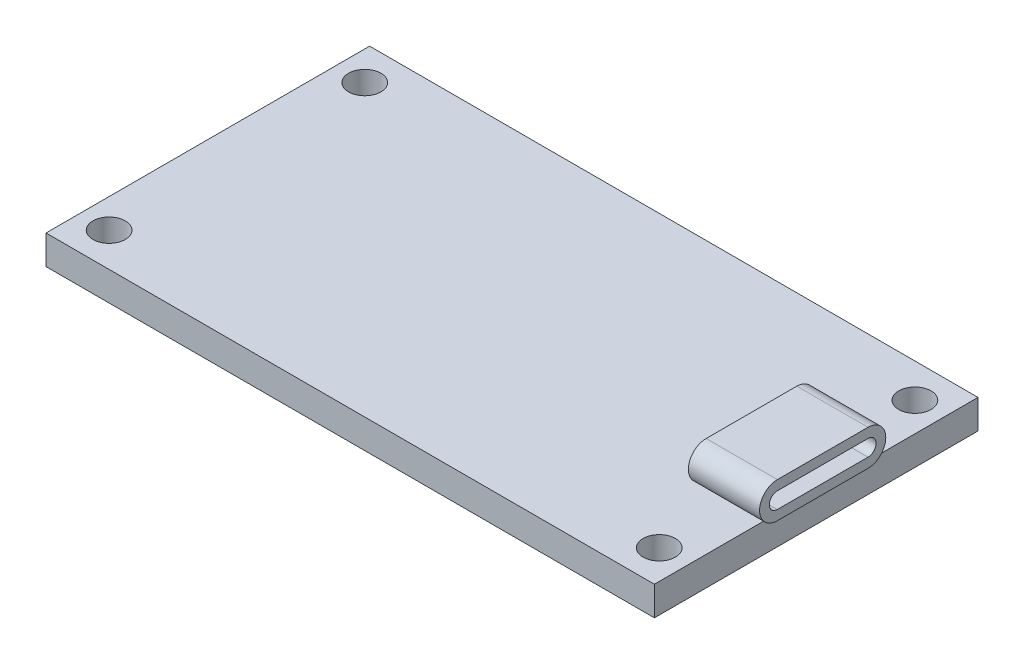
ISO-10303-21;
HEADER;
FILE_DESCRIPTION(('STEP AP214'),'2;1');
FILE_NAME('part.step','',(''),(''),'','','');
FILE_SCHEMA(('AUTOMOTIVE_DESIGN { 1 0 10303 214 1 1 1 1 }'));
ENDSEC;
DATA;
#1=APPLICATION_CONTEXT('core data for automotive mechanical design processes');
#2=APPLICATION_PROTOCOL_DEFINITION('international standard','automotive_design',2000,#1);
#3=PRODUCT_CONTEXT('',#1,'mechanical');
#4=PRODUCT('Part','Part','',(#3));
#5=PRODUCT_RELATED_PRODUCT_CATEGORY('part','',(#4));
#6=PRODUCT_DEFINITION_FORMATION('','',#4);
#7=PRODUCT_DEFINITION_CONTEXT('part definition',#1,'design');
#8=PRODUCT_DEFINITION('design','',#6,#7);
#9=PRODUCT_DEFINITION_SHAPE('','',#8);
#10=(LENGTH_UNIT() NAMED_UNIT(*) SI_UNIT(.MILLI.,.METRE.));
#11=(NAMED_UNIT(*) PLANE_ANGLE_UNIT() SI_UNIT($,.RADIAN.));
#12=(NAMED_UNIT(*) SI_UNIT($,.STERADIAN.) SOLID_ANGLE_UNIT());
#13=UNCERTAINTY_MEASURE_WITH_UNIT(LENGTH_MEASURE(1.E-05),#10,'distance_accuracy_value','');
#14=(GEOMETRIC_REPRESENTATION_CONTEXT(3) GLOBAL_UNCERTAINTY_ASSIGNED_CONTEXT((#13)) GLOBAL_UNIT_ASSIGNED_CONTEXT((#10,
#11,#12)) REPRESENTATION_CONTEXT('',''));
#15=CARTESIAN_POINT('',(0.,0.,0.));
#16=DIRECTION('',(0.,0.,1.));
#17=DIRECTION('',(1.,0.,0.));
#18=AXIS2_PLACEMENT_3D('',#15,#16,#17);
#19=CARTESIAN_POINT('',(0.,2.286,0.));
#20=DIRECTION('',(0.,1.,0.));
#21=DIRECTION('',(0.,0.,1.));
#22=AXIS2_PLACEMENT_3D('',#19,#20,#21);
#23=PLANE('',#22);
#24=DIRECTION('',(1.,0.,0.));
#25=VECTOR('',#24,1.);
#26=CARTESIAN_POINT('',(18.796,2.286,3.556));
#27=LINE('',#26,#25);
#28=CARTESIAN_POINT('',(18.796,2.286,3.556));
#29=VERTEX_POINT('',#28);
#30=CARTESIAN_POINT('',(23.876,2.286,3.556));
#31=VERTEX_POINT('',#30);
#32=EDGE_CURVE('E199',#29,#31,#27,.T.);
#33=ORIENTED_EDGE('',*,*,#32,.F.);
#34=DIRECTION('',(0.,0.,-1.));
#35=VECTOR('',#34,1.);
#36=CARTESIAN_POINT('',(18.796,2.286,3.556));
#37=LINE('',#36,#35);
#38=CARTESIAN_POINT('',(18.796,2.286,-3.556));
#39=VERTEX_POINT('',#38);
#40=EDGE_CURVE('E60',#29,#39,#37,.T.);
#41=ORIENTED_EDGE('',*,*,#40,.T.);
#42=DIRECTION('',(1.,0.,0.));
#43=VECTOR('',#42,1.);
#44=CARTESIAN_POINT('',(18.796,2.286,-3.556));
#45=LINE('',#44,#43);
#46=CARTESIAN_POINT('',(23.876,2.286,-3.556));
#47=VERTEX_POINT('',#46);
#48=EDGE_CURVE('E196',#39,#47,#45,.T.);
#49=ORIENTED_EDGE('',*,*,#48,.T.);
#50=DIRECTION('',(0.,0.,-1.));
#51=VECTOR('',#50,1.);
#52=CARTESIAN_POINT('',(23.876,2.286,-12.7));
#53=LINE('',#52,#51);
#54=CARTESIAN_POINT('',(23.876,2.286,-12.7));
#55=VERTEX_POINT('',#54);
#56=EDGE_CURVE('E231',#47,#55,#53,.T.);
#57=ORIENTED_EDGE('',*,*,#56,.T.);
#58=DIRECTION('',(-1.,0.,0.));
#59=VECTOR('',#58,1.);
#60=CARTESIAN_POINT('',(-23.876,2.286,-12.7));
#61=LINE('',#60,#59);
#62=CARTESIAN_POINT('',(-23.876,2.286,-12.7));
#63=VERTEX_POINT('',#62);
#64=EDGE_CURVE('E229',#55,#63,#61,.T.);
#65=ORIENTED_EDGE('',*,*,#64,.T.);
#66=DIRECTION('',(0.,0.,1.));
#67=VECTOR('',#66,1.);
#68=CARTESIAN_POINT('',(-23.876,2.286,-12.7));
#69=LINE('',#68,#67);
#70=CARTESIAN_POINT('',(-23.876,2.286,12.7));
#71=VERTEX_POINT('',#70);
#72=EDGE_CURVE('E233',#63,#71,#69,.T.);
#73=ORIENTED_EDGE('',*,*,#72,.T.);
#74=DIRECTION('',(1.,0.,0.));
#75=VECTOR('',#74,1.);
#76=CARTESIAN_POINT('',(-23.876,2.286,12.7));
#77=LINE('',#76,#75);
#78=CARTESIAN_POINT('',(23.876,2.286,12.7));
#79=VERTEX_POINT('',#78);
#80=EDGE_CURVE('E235',#71,#79,#77,.T.);
#81=ORIENTED_EDGE('',*,*,#80,.T.);
#82=EDGE_CURVE('E226',#79,#31,#53,.T.);
#83=ORIENTED_EDGE('',*,*,#82,.T.);
#84=EDGE_LOOP('',(#33,#41,#49,#57,#65,#73,#81,#83));
#85=FACE_BOUND('',#84,.T.);
#86=CARTESIAN_POINT('',(-21.59,2.286,10.033));
#87=DIRECTION('',(0.,1.,0.));
#88=DIRECTION('',(0.,0.,1.));
#89=AXIS2_PLACEMENT_3D('',#86,#87,#88);
#90=CIRCLE('',#89,1.27);
#91=CARTESIAN_POINT('',(-21.59,2.286,11.303));
#92=VERTEX_POINT('',#91);
#93=EDGE_CURVE('E208',#92,#92,#90,.T.);
#94=ORIENTED_EDGE('',*,*,#93,.F.);
#95=EDGE_LOOP('',(#94));
#96=FACE_BOUND('',#95,.T.);
#97=CARTESIAN_POINT('',(-21.59,2.286,-10.033));
#98=DIRECTION('',(0.,1.,0.));
#99=DIRECTION('',(0.,0.,1.));
#100=AXIS2_PLACEMENT_3D('',#97,#98,#99);
#101=CIRCLE('',#100,1.27);
#102=CARTESIAN_POINT('',(-21.59,2.286,-8.76300000000001));
#103=VERTEX_POINT('',#102);
#104=EDGE_CURVE('E220',#103,#103,#101,.T.);
#105=ORIENTED_EDGE('',*,*,#104,.F.);
#106=EDGE_LOOP('',(#105));
#107=FACE_BOUND('',#106,.T.);
#108=CARTESIAN_POINT('',(21.59,2.286,-10.033));
#109=DIRECTION('',(0.,1.,0.));
#110=DIRECTION('',(0.,0.,1.));
#111=AXIS2_PLACEMENT_3D('',#108,#109,#110);
#112=CIRCLE('',#111,1.27);
#113=CARTESIAN_POINT('',(21.59,2.286,-8.76300000000001));
#114=VERTEX_POINT('',#113);
#115=EDGE_CURVE('E214',#114,#114,#112,.T.);
#116=ORIENTED_EDGE('',*,*,#115,.F.);
#117=EDGE_LOOP('',(#116));
#118=FACE_BOUND('',#117,.T.);
#119=CARTESIAN_POINT('',(21.59,2.286,10.033));
#120=DIRECTION('',(0.,1.,0.));
#121=DIRECTION('',(0.,0.,1.));
#122=AXIS2_PLACEMENT_3D('',#119,#120,#121);
#123=CIRCLE('',#122,1.27);
#124=CARTESIAN_POINT('',(21.59,2.286,11.303));
#125=VERTEX_POINT('',#124);
#126=EDGE_CURVE('E202',#125,#125,#123,.T.);
#127=ORIENTED_EDGE('',*,*,#126,.F.);
#128=EDGE_LOOP('',(#127));
#129=FACE_BOUND('',#128,.T.);
#130=ADVANCED_FACE('F37',(#85,#96,#107,#118,#129),#23,.T.);
#131=CARTESIAN_POINT('',(0.,0.,0.));
#132=DIRECTION('',(0.,1.,0.));
#133=DIRECTION('',(0.,0.,1.));
#134=AXIS2_PLACEMENT_3D('',#131,#132,#133);
#135=PLANE('',#134);
#136=DIRECTION('',(0.,0.,-1.));
#137=VECTOR('',#136,1.);
#138=CARTESIAN_POINT('',(23.876,0.,-12.7));
#139=LINE('',#138,#137);
#140=CARTESIAN_POINT('',(23.876,0.,12.7));
#141=VERTEX_POINT('',#140);
#142=CARTESIAN_POINT('',(23.876,0.,-12.7));
#143=VERTEX_POINT('',#142);
#144=EDGE_CURVE('E223',#141,#143,#139,.T.);
#145=ORIENTED_EDGE('',*,*,#144,.F.);
#146=DIRECTION('',(1.,0.,0.));
#147=VECTOR('',#146,1.);
#148=CARTESIAN_POINT('',(-23.876,0.,12.7));
#149=LINE('',#148,#147);
#150=CARTESIAN_POINT('',(-23.876,0.,12.7));
#151=VERTEX_POINT('',#150);
#152=EDGE_CURVE('E244',#151,#141,#149,.T.);
#153=ORIENTED_EDGE('',*,*,#152,.F.);
#154=DIRECTION('',(0.,0.,1.));
#155=VECTOR('',#154,1.);
#156=CARTESIAN_POINT('',(-23.876,0.,-12.7));
#157=LINE('',#156,#155);
#158=CARTESIAN_POINT('',(-23.876,0.,-12.7));
#159=VERTEX_POINT('',#158);
#160=EDGE_CURVE('E242',#159,#151,#157,.T.);
#161=ORIENTED_EDGE('',*,*,#160,.F.);
#162=DIRECTION('',(-1.,0.,0.));
#163=VECTOR('',#162,1.);
#164=CARTESIAN_POINT('',(-23.876,0.,-12.7));
#165=LINE('',#164,#163);
#166=EDGE_CURVE('E240',#143,#159,#165,.T.);
#167=ORIENTED_EDGE('',*,*,#166,.F.);
#168=EDGE_LOOP('',(#145,#153,#161,#167));
#169=FACE_BOUND('',#168,.T.);
#170=CARTESIAN_POINT('',(-21.59,0.,-10.033));
#171=DIRECTION('',(0.,1.,0.));
#172=DIRECTION('',(0.,0.,1.));
#173=AXIS2_PLACEMENT_3D('',#170,#171,#172);
#174=CIRCLE('',#173,1.27);
#175=CARTESIAN_POINT('',(-21.59,0.,-8.76300000000001));
#176=VERTEX_POINT('',#175);
#177=EDGE_CURVE('E217',#176,#176,#174,.T.);
#178=ORIENTED_EDGE('',*,*,#177,.T.);
#179=EDGE_LOOP('',(#178));
#180=FACE_BOUND('',#179,.T.);
#181=CARTESIAN_POINT('',(21.59,0.,-10.033));
#182=DIRECTION('',(0.,1.,0.));
#183=DIRECTION('',(0.,0.,1.));
#184=AXIS2_PLACEMENT_3D('',#181,#182,#183);
#185=CIRCLE('',#184,1.27);
#186=CARTESIAN_POINT('',(21.59,0.,-8.76300000000001));
#187=VERTEX_POINT('',#186);
#188=EDGE_CURVE('E211',#187,#187,#185,.T.);
#189=ORIENTED_EDGE('',*,*,#188,.T.);
#190=EDGE_LOOP('',(#189));
#191=FACE_BOUND('',#190,.T.);
#192=CARTESIAN_POINT('',(-21.59,0.,10.033));
#193=DIRECTION('',(0.,1.,0.));
#194=DIRECTION('',(0.,0.,1.));
#195=AXIS2_PLACEMENT_3D('',#192,#193,#194);
#196=CIRCLE('',#195,1.27);
#197=CARTESIAN_POINT('',(-21.59,0.,11.303));
#198=VERTEX_POINT('',#197);
#199=EDGE_CURVE('E205',#198,#198,#196,.T.);
#200=ORIENTED_EDGE('',*,*,#199,.T.);
#201=EDGE_LOOP('',(#200));
#202=FACE_BOUND('',#201,.T.);
#203=CARTESIAN_POINT('',(21.59,0.,10.033));
#204=DIRECTION('',(0.,1.,0.));
#205=DIRECTION('',(0.,0.,1.));
#206=AXIS2_PLACEMENT_3D('',#203,#204,#205);
#207=CIRCLE('',#206,1.27);
#208=CARTESIAN_POINT('',(21.59,0.,11.303));
#209=VERTEX_POINT('',#208);
#210=EDGE_CURVE('E193',#209,#209,#207,.T.);
#211=ORIENTED_EDGE('',*,*,#210,.T.);
#212=EDGE_LOOP('',(#211));
#213=FACE_BOUND('',#212,.T.);
#214=ADVANCED_FACE('F262',(#169,#180,#191,#202,#213),#135,.F.);
#215=CARTESIAN_POINT('',(23.876,2.286,-12.7));
#216=DIRECTION('',(-1.,0.,0.));
#217=DIRECTION('',(0.,0.,1.));
#218=AXIS2_PLACEMENT_3D('',#215,#216,#217);
#219=PLANE('',#218);
#220=ORIENTED_EDGE('',*,*,#144,.T.);
#221=DIRECTION('',(0.,-1.,0.));
#222=VECTOR('',#221,1.);
#223=CARTESIAN_POINT('',(23.876,2.286,-12.7));
#224=LINE('',#223,#222);
#225=EDGE_CURVE('E12',#55,#143,#224,.T.);
#226=ORIENTED_EDGE('',*,*,#225,.F.);
#227=ORIENTED_EDGE('',*,*,#56,.F.);
#228=EDGE_CURVE('E230',#31,#47,#53,.T.);
#229=ORIENTED_EDGE('',*,*,#228,.F.);
#230=ORIENTED_EDGE('',*,*,#82,.F.);
#231=DIRECTION('',(0.,-1.,0.));
#232=VECTOR('',#231,1.);
#233=CARTESIAN_POINT('',(23.876,2.286,12.7));
#234=LINE('',#233,#232);
#235=EDGE_CURVE('E237',#79,#141,#234,.T.);
#236=ORIENTED_EDGE('',*,*,#235,.T.);
#237=EDGE_LOOP('',(#220,#226,#227,#229,#230,#236));
#238=FACE_BOUND('',#237,.T.);
#239=ADVANCED_FACE('F39',(#238),#219,.F.);
#240=CARTESIAN_POINT('',(-23.876,2.286,-12.7));
#241=DIRECTION('',(0.,0.,1.));
#242=DIRECTION('',(1.,0.,0.));
#243=AXIS2_PLACEMENT_3D('',#240,#241,#242);
#244=PLANE('',#243);
#245=ORIENTED_EDGE('',*,*,#166,.T.);
#246=DIRECTION('',(0.,-1.,0.));
#247=VECTOR('',#246,1.);
#248=CARTESIAN_POINT('',(-23.876,2.286,-12.7));
#249=LINE('',#248,#247);
#250=EDGE_CURVE('E45',#63,#159,#249,.T.);
#251=ORIENTED_EDGE('',*,*,#250,.F.);
#252=ORIENTED_EDGE('',*,*,#64,.F.);
#253=ORIENTED_EDGE('',*,*,#225,.T.);
#254=EDGE_LOOP('',(#245,#251,#252,#253));
#255=FACE_BOUND('',#254,.T.);
#256=ADVANCED_FACE('F292',(#255),#244,.F.);
#257=CARTESIAN_POINT('',(-23.876,2.286,-12.7));
#258=DIRECTION('',(1.,0.,0.));
#259=DIRECTION('',(0.,0.,-1.));
#260=AXIS2_PLACEMENT_3D('',#257,#258,#259);
#261=PLANE('',#260);
#262=ORIENTED_EDGE('',*,*,#160,.T.);
#263=DIRECTION('',(0.,-1.,0.));
#264=VECTOR('',#263,1.);
#265=CARTESIAN_POINT('',(-23.876,2.286,12.7));
#266=LINE('',#265,#264);
#267=EDGE_CURVE('E248',#71,#151,#266,.T.);
#268=ORIENTED_EDGE('',*,*,#267,.F.);
#269=ORIENTED_EDGE('',*,*,#72,.F.);
#270=ORIENTED_EDGE('',*,*,#250,.T.);
#271=EDGE_LOOP('',(#262,#268,#269,#270));
#272=FACE_BOUND('',#271,.T.);
#273=ADVANCED_FACE('F255',(#272),#261,.F.);
#274=CARTESIAN_POINT('',(-23.876,2.286,12.7));
#275=DIRECTION('',(0.,0.,-1.));
#276=DIRECTION('',(-1.,0.,0.));
#277=AXIS2_PLACEMENT_3D('',#274,#275,#276);
#278=PLANE('',#277);
#279=ORIENTED_EDGE('',*,*,#152,.T.);
#280=ORIENTED_EDGE('',*,*,#235,.F.);
#281=ORIENTED_EDGE('',*,*,#80,.F.);
#282=ORIENTED_EDGE('',*,*,#267,.T.);
#283=EDGE_LOOP('',(#279,#280,#281,#282));
#284=FACE_BOUND('',#283,.T.);
#285=ADVANCED_FACE('F266',(#284),#278,.F.);
#286=CARTESIAN_POINT('',(-21.59,2.286,-10.033));
#287=DIRECTION('',(0.,-1.,0.));
#288=DIRECTION('',(0.,0.,-1.));
#289=AXIS2_PLACEMENT_3D('',#286,#287,#288);
#290=CYLINDRICAL_SURFACE('',#289,1.27);
#291=ORIENTED_EDGE('',*,*,#104,.T.);
#292=EDGE_LOOP('',(#291));
#293=FACE_BOUND('',#292,.T.);
#294=ORIENTED_EDGE('',*,*,#177,.F.);
#295=EDGE_LOOP('',(#294));
#296=FACE_BOUND('',#295,.T.);
#297=ADVANCED_FACE('F306',(#293,#296),#290,.F.);
#298=CARTESIAN_POINT('',(21.59,2.286,-10.033));
#299=DIRECTION('',(0.,-1.,0.));
#300=DIRECTION('',(0.,0.,-1.));
#301=AXIS2_PLACEMENT_3D('',#298,#299,#300);
#302=CYLINDRICAL_SURFACE('',#301,1.27);
#303=ORIENTED_EDGE('',*,*,#115,.T.);
#304=EDGE_LOOP('',(#303));
#305=FACE_BOUND('',#304,.T.);
#306=ORIENTED_EDGE('',*,*,#188,.F.);
#307=EDGE_LOOP('',(#306));
#308=FACE_BOUND('',#307,.T.);
#309=ADVANCED_FACE('F313',(#305,#308),#302,.F.);
#310=CARTESIAN_POINT('',(-21.59,2.286,10.033));
#311=DIRECTION('',(0.,-1.,0.));
#312=DIRECTION('',(0.,0.,-1.));
#313=AXIS2_PLACEMENT_3D('',#310,#311,#312);
#314=CYLINDRICAL_SURFACE('',#313,1.27);
#315=ORIENTED_EDGE('',*,*,#93,.T.);
#316=EDGE_LOOP('',(#315));
#317=FACE_BOUND('',#316,.T.);
#318=ORIENTED_EDGE('',*,*,#199,.F.);
#319=EDGE_LOOP('',(#318));
#320=FACE_BOUND('',#319,.T.);
#321=ADVANCED_FACE('F318',(#317,#320),#314,.F.);
#322=CARTESIAN_POINT('',(21.59,2.286,10.033));
#323=DIRECTION('',(0.,-1.,0.));
#324=DIRECTION('',(0.,0.,-1.));
#325=AXIS2_PLACEMENT_3D('',#322,#323,#324);
#326=CYLINDRICAL_SURFACE('',#325,1.27);
#327=ORIENTED_EDGE('',*,*,#126,.T.);
#328=EDGE_LOOP('',(#327));
#329=FACE_BOUND('',#328,.T.);
#330=ORIENTED_EDGE('',*,*,#210,.F.);
#331=EDGE_LOOP('',(#330));
#332=FACE_BOUND('',#331,.T.);
#333=ADVANCED_FACE('F330',(#329,#332),#326,.F.);
#334=CARTESIAN_POINT('',(18.796,2.286,3.556));
#335=DIRECTION('',(0.,-1.,0.));
#336=DIRECTION('',(0.,0.,-1.));
#337=AXIS2_PLACEMENT_3D('',#334,#335,#336);
#338=PLANE('',#337);
#339=ORIENTED_EDGE('',*,*,#228,.T.);
#340=CARTESIAN_POINT('',(24.384,2.286,-3.556));
#341=VERTEX_POINT('',#340);
#342=EDGE_CURVE('E198',#47,#341,#45,.T.);
#343=ORIENTED_EDGE('',*,*,#342,.T.);
#344=DIRECTION('',(0.,0.,-1.));
#345=VECTOR('',#344,1.);
#346=CARTESIAN_POINT('',(24.384,2.286,3.556));
#347=LINE('',#346,#345);
#348=CARTESIAN_POINT('',(24.384,2.286,3.556));
#349=VERTEX_POINT('',#348);
#350=EDGE_CURVE('E171',#349,#341,#347,.T.);
#351=ORIENTED_EDGE('',*,*,#350,.F.);
#352=EDGE_CURVE('E190',#31,#349,#27,.T.);
#353=ORIENTED_EDGE('',*,*,#352,.F.);
#354=EDGE_LOOP('',(#339,#343,#351,#353));
#355=FACE_BOUND('',#354,.T.);
#356=ADVANCED_FACE('F276',(#355),#338,.T.);
#357=CARTESIAN_POINT('',(18.796,3.683,3.556));
#358=DIRECTION('',(1.,0.,0.));
#359=DIRECTION('',(0.,0.,-1.));
#360=AXIS2_PLACEMENT_3D('',#357,#358,#359);
#361=CYLINDRICAL_SURFACE('',#360,1.397);
#362=ORIENTED_EDGE('',*,*,#32,.T.);
#363=ORIENTED_EDGE('',*,*,#352,.T.);
#364=CARTESIAN_POINT('',(24.384,3.683,3.556));
#365=DIRECTION('',(1.,0.,0.));
#366=DIRECTION('',(0.,0.,-1.));
#367=AXIS2_PLACEMENT_3D('',#364,#365,#366);
#368=CIRCLE('',#367,1.397);
#369=CARTESIAN_POINT('',(24.384,5.08,3.556));
#370=VERTEX_POINT('',#369);
#371=EDGE_CURVE('E167',#370,#349,#368,.T.);
#372=ORIENTED_EDGE('',*,*,#371,.F.);
#373=DIRECTION('',(1.,0.,0.));
#374=VECTOR('',#373,1.);
#375=CARTESIAN_POINT('',(18.796,5.08,3.556));
#376=LINE('',#375,#374);
#377=CARTESIAN_POINT('',(18.796,5.08,3.556));
#378=VERTEX_POINT('',#377);
#379=EDGE_CURVE('E191',#378,#370,#376,.T.);
#380=ORIENTED_EDGE('',*,*,#379,.F.);
#381=CARTESIAN_POINT('',(18.796,3.683,3.556));
#382=DIRECTION('',(1.,0.,0.));
#383=DIRECTION('',(0.,0.,-1.));
#384=AXIS2_PLACEMENT_3D('',#381,#382,#383);
#385=CIRCLE('',#384,1.397);
#386=EDGE_CURVE('E180',#378,#29,#385,.T.);
#387=ORIENTED_EDGE('',*,*,#386,.T.);
#388=EDGE_LOOP('',(#362,#363,#372,#380,#387));
#389=FACE_BOUND('',#388,.T.);
#390=ADVANCED_FACE('F280',(#389),#361,.T.);
#391=CARTESIAN_POINT('',(18.796,5.08,3.556));
#392=DIRECTION('',(0.,1.,0.));
#393=DIRECTION('',(0.,0.,1.));
#394=AXIS2_PLACEMENT_3D('',#391,#392,#393);
#395=PLANE('',#394);
#396=ORIENTED_EDGE('',*,*,#379,.T.);
#397=DIRECTION('',(0.,0.,1.));
#398=VECTOR('',#397,1.);
#399=CARTESIAN_POINT('',(24.384,5.08,3.556));
#400=LINE('',#399,#398);
#401=CARTESIAN_POINT('',(24.384,5.08,-3.556));
#402=VERTEX_POINT('',#401);
#403=EDGE_CURVE('E177',#402,#370,#400,.T.);
#404=ORIENTED_EDGE('',*,*,#403,.F.);
#405=DIRECTION('',(1.,0.,0.));
#406=VECTOR('',#405,1.);
#407=CARTESIAN_POINT('',(18.796,5.08,-3.556));
#408=LINE('',#407,#406);
#409=CARTESIAN_POINT('',(18.796,5.08,-3.556));
#410=VERTEX_POINT('',#409);
#411=EDGE_CURVE('E194',#410,#402,#408,.T.);
#412=ORIENTED_EDGE('',*,*,#411,.F.);
#413=DIRECTION('',(0.,0.,1.));
#414=VECTOR('',#413,1.);
#415=CARTESIAN_POINT('',(18.796,5.08,3.556));
#416=LINE('',#415,#414);
#417=EDGE_CURVE('E187',#410,#378,#416,.T.);
#418=ORIENTED_EDGE('',*,*,#417,.T.);
#419=EDGE_LOOP('',(#396,#404,#412,#418));
#420=FACE_BOUND('',#419,.T.);
#421=ADVANCED_FACE('F287',(#420),#395,.T.);
#422=CARTESIAN_POINT('',(18.796,3.683,-3.556));
#423=DIRECTION('',(1.,0.,0.));
#424=DIRECTION('',(0.,0.,-1.));
#425=AXIS2_PLACEMENT_3D('',#422,#423,#424);
#426=CYLINDRICAL_SURFACE('',#425,1.397);
#427=ORIENTED_EDGE('',*,*,#411,.T.);
#428=CARTESIAN_POINT('',(24.384,3.683,-3.556));
#429=DIRECTION('',(1.,0.,0.));
#430=DIRECTION('',(0.,0.,-1.));
#431=AXIS2_PLACEMENT_3D('',#428,#429,#430);
#432=CIRCLE('',#431,1.397);
#433=EDGE_CURVE('E174',#341,#402,#432,.T.);
#434=ORIENTED_EDGE('',*,*,#433,.F.);
#435=ORIENTED_EDGE('',*,*,#342,.F.);
#436=ORIENTED_EDGE('',*,*,#48,.F.);
#437=CARTESIAN_POINT('',(18.796,3.683,-3.556));
#438=DIRECTION('',(1.,0.,0.));
#439=DIRECTION('',(0.,0.,-1.));
#440=AXIS2_PLACEMENT_3D('',#437,#438,#439);
#441=CIRCLE('',#440,1.397);
#442=EDGE_CURVE('E184',#39,#410,#441,.T.);
#443=ORIENTED_EDGE('',*,*,#442,.T.);
#444=EDGE_LOOP('',(#427,#434,#435,#436,#443));
#445=FACE_BOUND('',#444,.T.);
#446=ADVANCED_FACE('F291',(#445),#426,.T.);
#447=CARTESIAN_POINT('',(18.796,3.683,3.556));
#448=DIRECTION('',(1.,0.,0.));
#449=DIRECTION('',(0.,0.,-1.));
#450=AXIS2_PLACEMENT_3D('',#447,#448,#449);
#451=PLANE('',#450);
#452=ORIENTED_EDGE('',*,*,#386,.F.);
#453=ORIENTED_EDGE('',*,*,#417,.F.);
#454=ORIENTED_EDGE('',*,*,#442,.F.);
#455=ORIENTED_EDGE('',*,*,#40,.F.);
#456=EDGE_LOOP('',(#452,#453,#454,#455));
#457=FACE_BOUND('',#456,.T.);
#458=ADVANCED_FACE('F284',(#457),#451,.F.);
#459=CARTESIAN_POINT('',(24.384,3.683,3.556));
#460=DIRECTION('',(1.,0.,0.));
#461=DIRECTION('',(0.,0.,-1.));
#462=AXIS2_PLACEMENT_3D('',#459,#460,#461);
#463=PLANE('',#462);
#464=CARTESIAN_POINT('',(24.384,3.683,3.556));
#465=DIRECTION('',(1.,0.,0.));
#466=DIRECTION('',(0.,0.,-1.));
#467=AXIS2_PLACEMENT_3D('',#464,#465,#466);
#468=CIRCLE('',#467,0.635);
#469=CARTESIAN_POINT('',(24.384,4.318,3.556));
#470=VERTEX_POINT('',#469);
#471=CARTESIAN_POINT('',(24.384,3.048,3.556));
#472=VERTEX_POINT('',#471);
#473=EDGE_CURVE('E52',#470,#472,#468,.T.);
#474=ORIENTED_EDGE('',*,*,#473,.F.);
#475=DIRECTION('',(0.,0.,1.));
#476=VECTOR('',#475,1.);
#477=CARTESIAN_POINT('',(24.384,4.318,3.556));
#478=LINE('',#477,#476);
#479=CARTESIAN_POINT('',(24.384,4.318,-3.556));
#480=VERTEX_POINT('',#479);
#481=EDGE_CURVE('E156',#480,#470,#478,.T.);
#482=ORIENTED_EDGE('',*,*,#481,.F.);
#483=CARTESIAN_POINT('',(24.384,3.683,-3.556));
#484=DIRECTION('',(1.,0.,0.));
#485=DIRECTION('',(0.,0.,-1.));
#486=AXIS2_PLACEMENT_3D('',#483,#484,#485);
#487=CIRCLE('',#486,0.635);
#488=CARTESIAN_POINT('',(24.384,3.048,-3.556));
#489=VERTEX_POINT('',#488);
#490=EDGE_CURVE('E139',#489,#480,#487,.T.);
#491=ORIENTED_EDGE('',*,*,#490,.F.);
#492=DIRECTION('',(0.,0.,-1.));
#493=VECTOR('',#492,1.);
#494=CARTESIAN_POINT('',(24.384,3.048,3.556));
#495=LINE('',#494,#493);
#496=EDGE_CURVE('E149',#472,#489,#495,.T.);
#497=ORIENTED_EDGE('',*,*,#496,.F.);
#498=EDGE_LOOP('',(#474,#482,#491,#497));
#499=FACE_BOUND('',#498,.T.);
#500=ORIENTED_EDGE('',*,*,#371,.T.);
#501=ORIENTED_EDGE('',*,*,#350,.T.);
#502=ORIENTED_EDGE('',*,*,#433,.T.);
#503=ORIENTED_EDGE('',*,*,#403,.T.);
#504=EDGE_LOOP('',(#500,#501,#502,#503));
#505=FACE_BOUND('',#504,.T.);
#506=ADVANCED_FACE('F153',(#499,#505),#463,.T.);
#507=CARTESIAN_POINT('',(10.3183338117144,3.683,3.556));
#508=DIRECTION('',(1.,0.,0.));
#509=DIRECTION('',(0.,0.,-1.));
#510=AXIS2_PLACEMENT_3D('',#507,#508,#509);
#511=CYLINDRICAL_SURFACE('',#510,0.635);
#512=CARTESIAN_POINT('',(20.32,3.683,3.556));
#513=DIRECTION('',(1.,0.,0.));
#514=DIRECTION('',(0.,0.,-1.));
#515=AXIS2_PLACEMENT_3D('',#512,#513,#514);
#516=CIRCLE('',#515,0.635);
#517=CARTESIAN_POINT('',(20.32,3.048,3.556));
#518=VERTEX_POINT('',#517);
#519=CARTESIAN_POINT('',(20.32,4.318,3.556));
#520=VERTEX_POINT('',#519);
#521=EDGE_CURVE('E168',#518,#520,#516,.F.);
#522=ORIENTED_EDGE('',*,*,#521,.T.);
#523=DIRECTION('',(1.,0.,0.));
#524=VECTOR('',#523,1.);
#525=CARTESIAN_POINT('',(10.3183338117144,4.318,3.556));
#526=LINE('',#525,#524);
#527=EDGE_CURVE('E161',#520,#470,#526,.T.);
#528=ORIENTED_EDGE('',*,*,#527,.T.);
#529=ORIENTED_EDGE('',*,*,#473,.T.);
#530=DIRECTION('',(1.,0.,0.));
#531=VECTOR('',#530,1.);
#532=CARTESIAN_POINT('',(10.3183338117144,3.048,3.556));
#533=LINE('',#532,#531);
#534=EDGE_CURVE('E146',#518,#472,#533,.T.);
#535=ORIENTED_EDGE('',*,*,#534,.F.);
#536=EDGE_LOOP('',(#522,#528,#529,#535));
#537=FACE_BOUND('',#536,.T.);
#538=ADVANCED_FACE('F352',(#537),#511,.F.);
#539=CARTESIAN_POINT('',(10.3183338117144,4.318,3.556));
#540=DIRECTION('',(0.,1.,0.));
#541=DIRECTION('',(0.,0.,1.));
#542=AXIS2_PLACEMENT_3D('',#539,#540,#541);
#543=PLANE('',#542);
#544=DIRECTION('',(0.,0.,-1.));
#545=VECTOR('',#544,1.);
#546=CARTESIAN_POINT('',(20.32,4.318,3.556));
#547=LINE('',#546,#545);
#548=CARTESIAN_POINT('',(20.32,4.318,-3.556));
#549=VERTEX_POINT('',#548);
#550=EDGE_CURVE('E370',#520,#549,#547,.T.);
#551=ORIENTED_EDGE('',*,*,#550,.T.);
#552=DIRECTION('',(1.,0.,0.));
#553=VECTOR('',#552,1.);
#554=CARTESIAN_POINT('',(10.3183338117144,4.318,-3.556));
#555=LINE('',#554,#553);
#556=EDGE_CURVE('E145',#549,#480,#555,.T.);
#557=ORIENTED_EDGE('',*,*,#556,.T.);
#558=ORIENTED_EDGE('',*,*,#481,.T.);
#559=ORIENTED_EDGE('',*,*,#527,.F.);
#560=EDGE_LOOP('',(#551,#557,#558,#559));
#561=FACE_BOUND('',#560,.T.);
#562=ADVANCED_FACE('F355',(#561),#543,.F.);
#563=CARTESIAN_POINT('',(10.3183338117144,3.683,-3.556));
#564=DIRECTION('',(1.,0.,0.));
#565=DIRECTION('',(0.,0.,-1.));
#566=AXIS2_PLACEMENT_3D('',#563,#564,#565);
#567=CYLINDRICAL_SURFACE('',#566,0.635);
#568=CARTESIAN_POINT('',(20.32,3.683,-3.556));
#569=DIRECTION('',(1.,0.,0.));
#570=DIRECTION('',(0.,0.,-1.));
#571=AXIS2_PLACEMENT_3D('',#568,#569,#570);
#572=CIRCLE('',#571,0.635);
#573=CARTESIAN_POINT('',(20.32,3.048,-3.556));
#574=VERTEX_POINT('',#573);
#575=EDGE_CURVE('E142',#549,#574,#572,.F.);
#576=ORIENTED_EDGE('',*,*,#575,.T.);
#577=DIRECTION('',(1.,0.,0.));
#578=VECTOR('',#577,1.);
#579=CARTESIAN_POINT('',(10.3183338117144,3.048,-3.556));
#580=LINE('',#579,#578);
#581=EDGE_CURVE('E134',#574,#489,#580,.T.);
#582=ORIENTED_EDGE('',*,*,#581,.T.);
#583=ORIENTED_EDGE('',*,*,#490,.T.);
#584=ORIENTED_EDGE('',*,*,#556,.F.);
#585=EDGE_LOOP('',(#576,#582,#583,#584));
#586=FACE_BOUND('',#585,.T.);
#587=ADVANCED_FACE('F136',(#586),#567,.F.);
#588=CARTESIAN_POINT('',(10.3183338117144,3.048,3.556));
#589=DIRECTION('',(0.,-1.,0.));
#590=DIRECTION('',(0.,0.,-1.));
#591=AXIS2_PLACEMENT_3D('',#588,#589,#590);
#592=PLANE('',#591);
#593=DIRECTION('',(0.,0.,1.));
#594=VECTOR('',#593,1.);
#595=CARTESIAN_POINT('',(20.32,3.048,3.556));
#596=LINE('',#595,#594);
#597=EDGE_CURVE('E165',#574,#518,#596,.T.);
#598=ORIENTED_EDGE('',*,*,#597,.T.);
#599=ORIENTED_EDGE('',*,*,#534,.T.);
#600=ORIENTED_EDGE('',*,*,#496,.T.);
#601=ORIENTED_EDGE('',*,*,#581,.F.);
#602=EDGE_LOOP('',(#598,#599,#600,#601));
#603=FACE_BOUND('',#602,.T.);
#604=ADVANCED_FACE('F150',(#603),#592,.F.);
#605=CARTESIAN_POINT('',(20.32,3.683,3.556));
#606=DIRECTION('',(1.,0.,0.));
#607=DIRECTION('',(0.,0.,-1.));
#608=AXIS2_PLACEMENT_3D('',#605,#606,#607);
#609=PLANE('',#608);
#610=ORIENTED_EDGE('',*,*,#521,.F.);
#611=ORIENTED_EDGE('',*,*,#597,.F.);
#612=ORIENTED_EDGE('',*,*,#575,.F.);
#613=ORIENTED_EDGE('',*,*,#550,.F.);
#614=EDGE_LOOP('',(#610,#611,#612,#613));
#615=FACE_BOUND('',#614,.T.);
#616=ADVANCED_FACE('F358',(#615),#609,.T.);
#617=CLOSED_SHELL('',(#130,#214,#239,#256,#273,#285,#297,#309,#321,#333,#356,#390,#421,#446,
#458,#506,#538,#562,#587,#604,#616));
#618=MANIFOLD_SOLID_BREP('B2',#617);
#619=ADVANCED_BREP_SHAPE_REPRESENTATION('',(#18,#618),#14);
#620=SHAPE_DEFINITION_REPRESENTATION(#9,#619);
ENDSEC;
END-ISO-10303-21;
